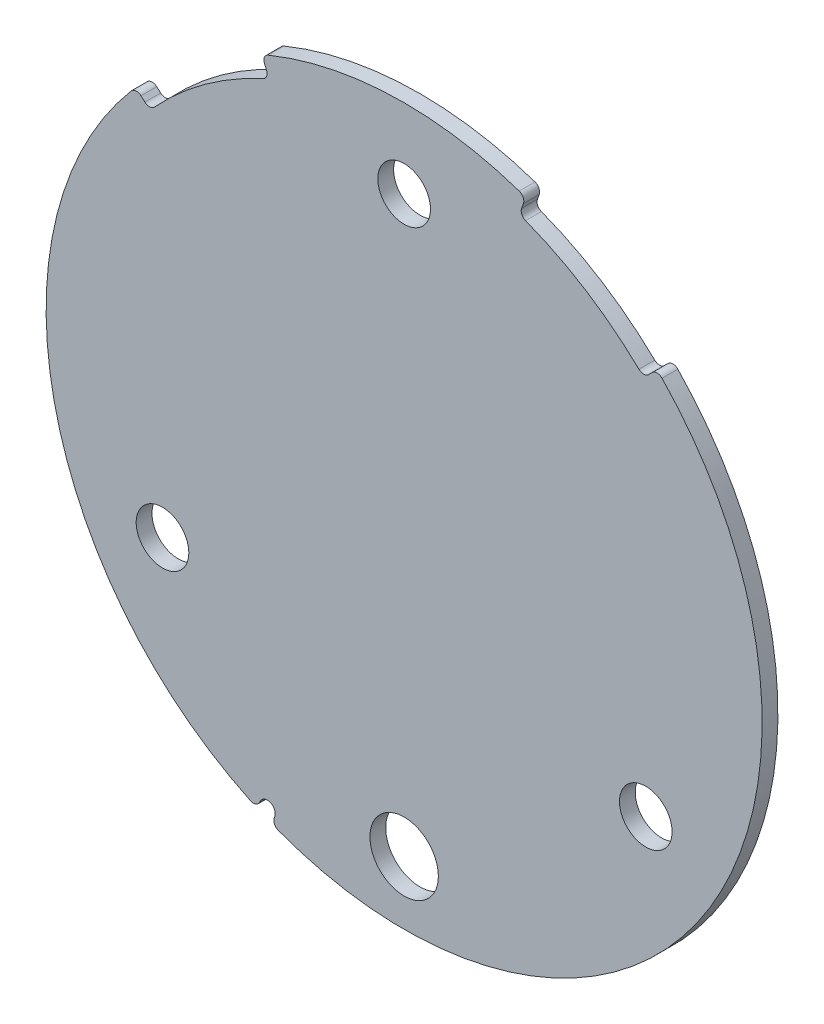
ISO-10303-21;
HEADER;
FILE_DESCRIPTION(('STEP AP214'),'2;1');
FILE_NAME('part.step','',(''),(''),'','','');
FILE_SCHEMA(('AUTOMOTIVE_DESIGN { 1 0 10303 214 1 1 1 1 }'));
ENDSEC;
DATA;
#1=APPLICATION_CONTEXT('core data for automotive mechanical design processes');
#2=APPLICATION_PROTOCOL_DEFINITION('international standard','automotive_design',2000,#1);
#3=PRODUCT_CONTEXT('',#1,'mechanical');
#4=PRODUCT('Part','Part','',(#3));
#5=PRODUCT_RELATED_PRODUCT_CATEGORY('part','',(#4));
#6=PRODUCT_DEFINITION_FORMATION('','',#4);
#7=PRODUCT_DEFINITION_CONTEXT('part definition',#1,'design');
#8=PRODUCT_DEFINITION('design','',#6,#7);
#9=PRODUCT_DEFINITION_SHAPE('','',#8);
#10=(LENGTH_UNIT() NAMED_UNIT(*) SI_UNIT(.MILLI.,.METRE.));
#11=(NAMED_UNIT(*) PLANE_ANGLE_UNIT() SI_UNIT($,.RADIAN.));
#12=(NAMED_UNIT(*) SI_UNIT($,.STERADIAN.) SOLID_ANGLE_UNIT());
#13=UNCERTAINTY_MEASURE_WITH_UNIT(LENGTH_MEASURE(1.E-05),#10,'distance_accuracy_value','');
#14=(GEOMETRIC_REPRESENTATION_CONTEXT(3) GLOBAL_UNCERTAINTY_ASSIGNED_CONTEXT((#13)) GLOBAL_UNIT_ASSIGNED_CONTEXT((#10,
#11,#12)) REPRESENTATION_CONTEXT('',''));
#15=CARTESIAN_POINT('',(0.,0.,0.));
#16=DIRECTION('',(0.,0.,1.));
#17=DIRECTION('',(1.,0.,0.));
#18=AXIS2_PLACEMENT_3D('',#15,#16,#17);
#19=CARTESIAN_POINT('',(0.,0.,1.5));
#20=DIRECTION('',(0.,0.,-1.));
#21=DIRECTION('',(-1.,0.,0.));
#22=AXIS2_PLACEMENT_3D('',#19,#20,#21);
#23=CYLINDRICAL_SURFACE('',#22,34.0030767667637);
#24=CARTESIAN_POINT('',(0.,0.,0.));
#25=DIRECTION('',(0.,0.,1.));
#26=DIRECTION('',(-1.,0.,0.));
#27=AXIS2_PLACEMENT_3D('',#24,#25,#26);
#28=CIRCLE('',#27,34.0030767667637);
#29=CARTESIAN_POINT('',(-25.9225243432384,22.0052712157937,0.));
#30=VERTEX_POINT('',#29);
#31=CARTESIAN_POINT('',(-14.58996740595,-30.7138744006636,0.));
#32=VERTEX_POINT('',#31);
#33=EDGE_CURVE('E323',#30,#32,#28,.T.);
#34=ORIENTED_EDGE('',*,*,#33,.T.);
#35=DIRECTION('',(0.,0.,-1.));
#36=VECTOR('',#35,1.);
#37=CARTESIAN_POINT('',(-14.58996740595,-30.7138744006636,1.5));
#38=LINE('',#37,#36);
#39=CARTESIAN_POINT('',(-14.58996740595,-30.7138744006636,1.5));
#40=VERTEX_POINT('',#39);
#41=EDGE_CURVE('E56',#32,#40,#38,.F.);
#42=ORIENTED_EDGE('',*,*,#41,.T.);
#43=CARTESIAN_POINT('',(0.,0.,1.5));
#44=DIRECTION('',(0.,0.,1.));
#45=DIRECTION('',(-1.,0.,0.));
#46=AXIS2_PLACEMENT_3D('',#43,#44,#45);
#47=CIRCLE('',#46,34.0030767667637);
#48=CARTESIAN_POINT('',(-25.9225243432384,22.0052712157937,1.5));
#49=VERTEX_POINT('',#48);
#50=EDGE_CURVE('E250',#49,#40,#47,.T.);
#51=ORIENTED_EDGE('',*,*,#50,.F.);
#52=DIRECTION('',(0.,0.,-1.));
#53=VECTOR('',#52,1.);
#54=CARTESIAN_POINT('',(-25.9225243432384,22.0052712157937,1.5));
#55=LINE('',#54,#53);
#56=EDGE_CURVE('E404',#49,#30,#55,.T.);
#57=ORIENTED_EDGE('',*,*,#56,.T.);
#58=EDGE_LOOP('',(#34,#42,#51,#57));
#59=FACE_BOUND('',#58,.T.);
#60=ADVANCED_FACE('F48',(#59),#23,.T.);
#61=CARTESIAN_POINT('',(-11.9586692957327,-31.8307941823908,1.5));
#62=VERTEX_POINT('',#61);
#63=CARTESIAN_POINT('',(24.4958433784449,23.5831059613682,1.5));
#64=VERTEX_POINT('',#63);
#65=EDGE_CURVE('E251',#62,#64,#47,.T.);
#66=ORIENTED_EDGE('',*,*,#65,.F.);
#67=DIRECTION('',(0.,0.,-1.));
#68=VECTOR('',#67,1.);
#69=CARTESIAN_POINT('',(-11.9586692957327,-31.8307941823908,1.5));
#70=LINE('',#69,#68);
#71=CARTESIAN_POINT('',(-11.9586692957327,-31.8307941823908,0.));
#72=VERTEX_POINT('',#71);
#73=EDGE_CURVE('E424',#62,#72,#70,.T.);
#74=ORIENTED_EDGE('',*,*,#73,.T.);
#75=CARTESIAN_POINT('',(24.4958433784449,23.5831059613682,0.));
#76=VERTEX_POINT('',#75);
#77=EDGE_CURVE('E319',#72,#76,#28,.T.);
#78=ORIENTED_EDGE('',*,*,#77,.T.);
#79=DIRECTION('',(0.,0.,-1.));
#80=VECTOR('',#79,1.);
#81=CARTESIAN_POINT('',(24.4958433784449,23.5831059613682,1.5));
#82=LINE('',#81,#80);
#83=EDGE_CURVE('E757',#76,#64,#82,.F.);
#84=ORIENTED_EDGE('',*,*,#83,.T.);
#85=EDGE_LOOP('',(#66,#74,#78,#84));
#86=FACE_BOUND('',#85,.T.);
#87=ADVANCED_FACE('F483',(#86),#23,.T.);
#88=CARTESIAN_POINT('',(0.,-28.0037090147275,1.5));
#89=DIRECTION('',(0.,0.,-1.));
#90=DIRECTION('',(-1.,0.,0.));
#91=AXIS2_PLACEMENT_3D('',#88,#89,#90);
#92=CYLINDRICAL_SURFACE('',#91,3.25);
#93=CARTESIAN_POINT('',(0.,-28.0037090147275,1.5));
#94=DIRECTION('',(0.,0.,1.));
#95=DIRECTION('',(1.,0.,0.));
#96=AXIS2_PLACEMENT_3D('',#93,#94,#95);
#97=CIRCLE('',#96,3.25);
#98=CARTESIAN_POINT('',(3.25,-28.0037090147275,1.5));
#99=VERTEX_POINT('',#98);
#100=EDGE_CURVE('E315',#99,#99,#97,.T.);
#101=ORIENTED_EDGE('',*,*,#100,.T.);
#102=EDGE_LOOP('',(#101));
#103=FACE_BOUND('',#102,.T.);
#104=CARTESIAN_POINT('',(0.,-28.0037090147275,0.));
#105=DIRECTION('',(0.,0.,1.));
#106=DIRECTION('',(1.,0.,0.));
#107=AXIS2_PLACEMENT_3D('',#104,#105,#106);
#108=CIRCLE('',#107,3.25);
#109=CARTESIAN_POINT('',(3.25,-28.0037090147275,0.));
#110=VERTEX_POINT('',#109);
#111=EDGE_CURVE('E252',#110,#110,#108,.T.);
#112=ORIENTED_EDGE('',*,*,#111,.F.);
#113=EDGE_LOOP('',(#112));
#114=FACE_BOUND('',#113,.T.);
#115=ADVANCED_FACE('F488',(#103,#114),#92,.F.);
#116=CARTESIAN_POINT('',(10.9270923149167,32.1995012872515,0.));
#117=VERTEX_POINT('',#116);
#118=CARTESIAN_POINT('',(-12.917756023464,31.4537884669667,0.));
#119=VERTEX_POINT('',#118);
#120=EDGE_CURVE('E253',#117,#119,#28,.T.);
#121=ORIENTED_EDGE('',*,*,#120,.T.);
#122=DIRECTION('',(0.,0.,-1.));
#123=VECTOR('',#122,1.);
#124=CARTESIAN_POINT('',(-12.917756023464,31.4537884669667,1.5));
#125=LINE('',#124,#123);
#126=CARTESIAN_POINT('',(-12.917756023464,31.4537884669667,1.5));
#127=VERTEX_POINT('',#126);
#128=EDGE_CURVE('E386',#119,#127,#125,.F.);
#129=ORIENTED_EDGE('',*,*,#128,.T.);
#130=CARTESIAN_POINT('',(10.9270923149167,32.1995012872515,1.5));
#131=VERTEX_POINT('',#130);
#132=EDGE_CURVE('E243',#131,#127,#47,.T.);
#133=ORIENTED_EDGE('',*,*,#132,.F.);
#134=DIRECTION('',(0.,0.,-1.));
#135=VECTOR('',#134,1.);
#136=CARTESIAN_POINT('',(10.9270923149167,32.1995012872515,1.5));
#137=LINE('',#136,#135);
#138=EDGE_CURVE('E360',#131,#117,#137,.T.);
#139=ORIENTED_EDGE('',*,*,#138,.T.);
#140=EDGE_LOOP('',(#121,#129,#133,#139));
#141=FACE_BOUND('',#140,.T.);
#142=ADVANCED_FACE('F443',(#141),#23,.T.);
#143=CARTESIAN_POINT('',(0.,-28.0037090147275,1.5));
#144=DIRECTION('',(0.,0.,-1.));
#145=DIRECTION('',(-1.,0.,0.));
#146=AXIS2_PLACEMENT_3D('',#143,#144,#145);
#147=PLANE('',#146);
#148=CARTESIAN_POINT('',(-22.9496732002842,-13.250000000002,1.5));
#149=DIRECTION('',(0.,0.,1.));
#150=DIRECTION('',(1.,0.,0.));
#151=AXIS2_PLACEMENT_3D('',#148,#149,#150);
#152=CIRCLE('',#151,2.50000000000405);
#153=CARTESIAN_POINT('',(-20.4496732002802,-13.250000000002,1.5));
#154=VERTEX_POINT('',#153);
#155=EDGE_CURVE('E232',#154,#154,#152,.T.);
#156=ORIENTED_EDGE('',*,*,#155,.F.);
#157=EDGE_LOOP('',(#156));
#158=FACE_BOUND('',#157,.T.);
#159=CARTESIAN_POINT('',(22.949673200291,-13.249999999998,1.5));
#160=DIRECTION('',(0.,0.,1.));
#161=DIRECTION('',(1.,0.,0.));
#162=AXIS2_PLACEMENT_3D('',#159,#160,#161);
#163=CIRCLE('',#162,2.50000000000279);
#164=CARTESIAN_POINT('',(25.4496732002938,-13.249999999998,1.5));
#165=VERTEX_POINT('',#164);
#166=EDGE_CURVE('E524',#165,#165,#163,.T.);
#167=ORIENTED_EDGE('',*,*,#166,.F.);
#168=EDGE_LOOP('',(#167));
#169=FACE_BOUND('',#168,.T.);
#170=CARTESIAN_POINT('',(0.,26.5,1.5));
#171=DIRECTION('',(0.,0.,1.));
#172=DIRECTION('',(1.,0.,0.));
#173=AXIS2_PLACEMENT_3D('',#170,#171,#172);
#174=CIRCLE('',#173,2.5);
#175=CARTESIAN_POINT('',(2.5,26.5,1.5));
#176=VERTEX_POINT('',#175);
#177=EDGE_CURVE('E525',#176,#176,#174,.T.);
#178=ORIENTED_EDGE('',*,*,#177,.F.);
#179=EDGE_LOOP('',(#178));
#180=FACE_BOUND('',#179,.T.);
#181=DIRECTION('',(0.369870387810276,0.92908336344005,0.));
#182=VECTOR('',#181,1.);
#183=CARTESIAN_POINT('',(0.,0.,1.5));
#184=LINE('',#183,#182);
#185=CARTESIAN_POINT('',(-12.3339725498959,-30.9819036043308,1.5));
#186=VERTEX_POINT('',#185);
#187=CARTESIAN_POINT('',(-12.296199688238,-30.8870213468903,1.5));
#188=VERTEX_POINT('',#187);
#189=EDGE_CURVE('E214',#186,#188,#184,.T.);
#190=ORIENTED_EDGE('',*,*,#189,.F.);
#191=CARTESIAN_POINT('',(-11.7300683636599,-31.2223193564075,1.5));
#192=DIRECTION('',(0.,0.,-1.));
#193=DIRECTION('',(-1.,0.,0.));
#194=AXIS2_PLACEMENT_3D('',#191,#192,#193);
#195=CIRCLE('',#194,0.65);
#196=EDGE_CURVE('E421',#186,#62,#195,.F.);
#197=ORIENTED_EDGE('',*,*,#196,.T.);
#198=ORIENTED_EDGE('',*,*,#65,.T.);
#199=CARTESIAN_POINT('',(24.0275828646919,23.1322932605048,1.5));
#200=DIRECTION('',(0.,0.,-1.));
#201=DIRECTION('',(-1.,0.,0.));
#202=AXIS2_PLACEMENT_3D('',#199,#200,#201);
#203=CIRCLE('',#202,0.65);
#204=CARTESIAN_POINT('',(23.5677301064265,23.5916791992488,1.5));
#205=VERTEX_POINT('',#204);
#206=EDGE_CURVE('E362',#64,#205,#203,.F.);
#207=ORIENTED_EDGE('',*,*,#206,.T.);
#208=DIRECTION('',(0.706747598067706,0.707465781946751,0.));
#209=VECTOR('',#208,1.);
#210=CARTESIAN_POINT('',(0.,0.,1.5));
#211=LINE('',#210,#209);
#212=CARTESIAN_POINT('',(23.2142881607075,23.237878092341,1.5));
#213=VERTEX_POINT('',#212);
#214=EDGE_CURVE('E311',#213,#205,#211,.T.);
#215=ORIENTED_EDGE('',*,*,#214,.F.);
#216=CARTESIAN_POINT('',(22.7544354024422,23.697264031085,1.5));
#217=DIRECTION('',(0.,0.,-1.));
#218=DIRECTION('',(-1.,0.,0.));
#219=AXIS2_PLACEMENT_3D('',#216,#217,#218);
#220=CIRCLE('',#219,0.65);
#221=CARTESIAN_POINT('',(22.3042375985473,23.2284123089294,1.5));
#222=VERTEX_POINT('',#221);
#223=EDGE_CURVE('E364',#213,#222,#220,.T.);
#224=ORIENTED_EDGE('',*,*,#223,.T.);
#225=CARTESIAN_POINT('',(0.,0.,1.5));
#226=DIRECTION('',(0.,0.,1.));
#227=DIRECTION('',(1.,0.,0.));
#228=AXIS2_PLACEMENT_3D('',#225,#226,#227);
#229=CIRCLE('',#228,32.2030767667637);
#230=CARTESIAN_POINT('',(11.538084564747,30.0651086447866,1.5));
#231=VERTEX_POINT('',#230);
#232=EDGE_CURVE('E328',#231,#222,#229,.F.);
#233=ORIENTED_EDGE('',*,*,#232,.F.);
#234=CARTESIAN_POINT('',(11.7709739566956,30.6719550265982,1.5));
#235=DIRECTION('',(0.,0.,-1.));
#236=DIRECTION('',(-1.,0.,0.));
#237=AXIS2_PLACEMENT_3D('',#234,#235,#236);
#238=CIRCLE('',#237,0.65);
#239=CARTESIAN_POINT('',(11.1596386311386,30.8927923416655,1.5));
#240=VERTEX_POINT('',#239);
#241=EDGE_CURVE('E353',#231,#240,#238,.T.);
#242=ORIENTED_EDGE('',*,*,#241,.T.);
#243=DIRECTION('',(0.339749715488171,0.94051588547228,0.));
#244=VECTOR('',#243,1.);
#245=CARTESIAN_POINT('',(0.,0.,1.5));
#246=LINE('',#245,#244);
#247=CARTESIAN_POINT('',(11.329546248551,31.3631409717135,1.5));
#248=VERTEX_POINT('',#247);
#249=EDGE_CURVE('E281',#240,#248,#246,.T.);
#250=ORIENTED_EDGE('',*,*,#249,.T.);
#251=CARTESIAN_POINT('',(10.718210922994,31.5839782867808,1.5));
#252=DIRECTION('',(0.,0.,-1.));
#253=DIRECTION('',(-1.,0.,0.));
#254=AXIS2_PLACEMENT_3D('',#251,#252,#253);
#255=CIRCLE('',#254,0.65);
#256=EDGE_CURVE('E350',#248,#131,#255,.F.);
#257=ORIENTED_EDGE('',*,*,#256,.T.);
#258=ORIENTED_EDGE('',*,*,#132,.T.);
#259=CARTESIAN_POINT('',(-12.6708212689167,30.8525204510231,1.5));
#260=DIRECTION('',(0.,0.,-1.));
#261=DIRECTION('',(-1.,0.,0.));
#262=AXIS2_PLACEMENT_3D('',#259,#260,#261);
#263=CIRCLE('',#262,0.65);
#264=CARTESIAN_POINT('',(-13.2671627159064,30.5939148080022,1.5));
#265=VERTEX_POINT('',#264);
#266=EDGE_CURVE('E392',#127,#265,#263,.F.);
#267=ORIENTED_EDGE('',*,*,#266,.T.);
#268=DIRECTION('',(-0.397854835416819,0.917448379984104,0.));
#269=VECTOR('',#268,1.);
#270=CARTESIAN_POINT('',(-12.8109257004215,29.5418378354882,1.5));
#271=LINE('',#270,#269);
#272=CARTESIAN_POINT('',(-13.0669725896484,30.1322788275527,1.5));
#273=VERTEX_POINT('',#272);
#274=EDGE_CURVE('E267',#273,#265,#271,.T.);
#275=ORIENTED_EDGE('',*,*,#274,.F.);
#276=CARTESIAN_POINT('',(-13.6633140366381,29.8736731845317,1.5));
#277=DIRECTION('',(0.,0.,-1.));
#278=DIRECTION('',(-1.,0.,0.));
#279=AXIS2_PLACEMENT_3D('',#276,#277,#278);
#280=CIRCLE('',#279,0.65);
#281=CARTESIAN_POINT('',(-13.3929592687898,29.2825654959489,1.5));
#282=VERTEX_POINT('',#281);
#283=EDGE_CURVE('E410',#273,#282,#280,.T.);
#284=ORIENTED_EDGE('',*,*,#283,.T.);
#285=CARTESIAN_POINT('',(0.,0.,1.5));
#286=DIRECTION('',(0.,0.,-1.));
#287=DIRECTION('',(-1.,0.,0.));
#288=AXIS2_PLACEMENT_3D('',#285,#286,#287);
#289=CIRCLE('',#288,32.2);
#290=CARTESIAN_POINT('',(-23.7107227097344,21.7862715622037,1.5));
#291=VERTEX_POINT('',#290);
#292=EDGE_CURVE('E274',#291,#282,#289,.T.);
#293=ORIENTED_EDGE('',*,*,#292,.F.);
#294=CARTESIAN_POINT('',(-24.1893553110178,22.226056547155,1.5));
#295=DIRECTION('',(0.,0.,-1.));
#296=DIRECTION('',(-1.,0.,0.));
#297=AXIS2_PLACEMENT_3D('',#294,#295,#296);
#298=CIRCLE('',#297,0.65);
#299=CARTESIAN_POINT('',(-24.6195835345336,21.7388156665934,1.5));
#300=VERTEX_POINT('',#299);
#301=EDGE_CURVE('E405',#291,#300,#298,.T.);
#302=ORIENTED_EDGE('',*,*,#301,.T.);
#303=DIRECTION('',(0.749601354710271,-0.661889574639551,0.));
#304=VECTOR('',#303,1.);
#305=CARTESIAN_POINT('',(-24.1371636216708,21.3128443033935,1.5));
#306=LINE('',#305,#304);
#307=CARTESIAN_POINT('',(-24.9967632907766,22.0718611538428,1.5));
#308=VERTEX_POINT('',#307);
#309=EDGE_CURVE('E273',#308,#300,#306,.T.);
#310=ORIENTED_EDGE('',*,*,#309,.F.);
#311=CARTESIAN_POINT('',(-25.4269915142923,21.5846202732812,1.5));
#312=DIRECTION('',(0.,0.,-1.));
#313=DIRECTION('',(-1.,0.,0.));
#314=AXIS2_PLACEMENT_3D('',#311,#312,#313);
#315=CIRCLE('',#314,0.65);
#316=EDGE_CURVE('E389',#308,#49,#315,.F.);
#317=ORIENTED_EDGE('',*,*,#316,.T.);
#318=ORIENTED_EDGE('',*,*,#50,.T.);
#319=CARTESIAN_POINT('',(-14.3110667970752,-30.1267505207462,1.5));
#320=DIRECTION('',(0.,0.,-1.));
#321=DIRECTION('',(-1.,0.,0.));
#322=AXIS2_PLACEMENT_3D('',#319,#320,#321);
#323=CIRCLE('',#322,0.65);
#324=CARTESIAN_POINT('',(-13.718619080054,-30.3941560229267,1.5));
#325=VERTEX_POINT('',#324);
#326=EDGE_CURVE('E418',#40,#325,#323,.F.);
#327=ORIENTED_EDGE('',*,*,#326,.T.);
#328=DIRECTION('',(0.411393080277604,0.911458026186453,0.));
#329=VECTOR('',#328,1.);
#330=CARTESIAN_POINT('',(0.,0.,1.5));
#331=LINE('',#330,#329);
#332=CARTESIAN_POINT('',(-13.6766057304579,-30.3010737458243,1.5));
#333=VERTEX_POINT('',#332);
#334=EDGE_CURVE('E208',#325,#333,#331,.T.);
#335=ORIENTED_EDGE('',*,*,#334,.T.);
#336=CARTESIAN_POINT('',(-12.9930122108181,-30.6096185560325,1.5));
#337=DIRECTION('',(0.,0.,1.));
#338=DIRECTION('',(1.,0.,0.));
#339=AXIS2_PLACEMENT_3D('',#336,#337,#338);
#340=CIRCLE('',#339,0.750000000000003);
#341=EDGE_CURVE('E231',#188,#333,#340,.T.);
#342=ORIENTED_EDGE('',*,*,#341,.F.);
#343=EDGE_LOOP('',(#190,#197,#198,#207,#215,#224,#233,#242,#250,#257,#258,#267,#275,#284,#293,
#302,#310,#317,#318,#327,#335,#342));
#344=FACE_BOUND('',#343,.T.);
#345=ORIENTED_EDGE('',*,*,#100,.F.);
#346=EDGE_LOOP('',(#345));
#347=FACE_BOUND('',#346,.T.);
#348=ADVANCED_FACE('F348',(#158,#169,#180,#344,#347),#147,.F.);
#349=CARTESIAN_POINT('',(0.,-28.0037090147275,0.));
#350=DIRECTION('',(0.,0.,-1.));
#351=DIRECTION('',(-1.,0.,0.));
#352=AXIS2_PLACEMENT_3D('',#349,#350,#351);
#353=PLANE('',#352);
#354=CARTESIAN_POINT('',(-22.9496732002842,-13.250000000002,0.));
#355=DIRECTION('',(0.,0.,1.));
#356=DIRECTION('',(1.,0.,0.));
#357=AXIS2_PLACEMENT_3D('',#354,#355,#356);
#358=CIRCLE('',#357,2.50000000000405);
#359=CARTESIAN_POINT('',(-20.4496732002802,-13.250000000002,0.));
#360=VERTEX_POINT('',#359);
#361=EDGE_CURVE('E515',#360,#360,#358,.T.);
#362=ORIENTED_EDGE('',*,*,#361,.T.);
#363=EDGE_LOOP('',(#362));
#364=FACE_BOUND('',#363,.T.);
#365=CARTESIAN_POINT('',(22.949673200291,-13.249999999998,0.));
#366=DIRECTION('',(0.,0.,1.));
#367=DIRECTION('',(1.,0.,0.));
#368=AXIS2_PLACEMENT_3D('',#365,#366,#367);
#369=CIRCLE('',#368,2.50000000000279);
#370=CARTESIAN_POINT('',(25.4496732002938,-13.249999999998,0.));
#371=VERTEX_POINT('',#370);
#372=EDGE_CURVE('E519',#371,#371,#369,.T.);
#373=ORIENTED_EDGE('',*,*,#372,.T.);
#374=EDGE_LOOP('',(#373));
#375=FACE_BOUND('',#374,.T.);
#376=CARTESIAN_POINT('',(0.,26.5,0.));
#377=DIRECTION('',(0.,0.,1.));
#378=DIRECTION('',(1.,0.,0.));
#379=AXIS2_PLACEMENT_3D('',#376,#377,#378);
#380=CIRCLE('',#379,2.5);
#381=CARTESIAN_POINT('',(2.5,26.5,0.));
#382=VERTEX_POINT('',#381);
#383=EDGE_CURVE('E522',#382,#382,#380,.T.);
#384=ORIENTED_EDGE('',*,*,#383,.T.);
#385=EDGE_LOOP('',(#384));
#386=FACE_BOUND('',#385,.T.);
#387=ORIENTED_EDGE('',*,*,#77,.F.);
#388=CARTESIAN_POINT('',(-11.7300683636599,-31.2223193564075,0.));
#389=DIRECTION('',(0.,0.,-1.));
#390=DIRECTION('',(-1.,0.,0.));
#391=AXIS2_PLACEMENT_3D('',#388,#389,#390);
#392=CIRCLE('',#391,0.65);
#393=CARTESIAN_POINT('',(-12.3339725498959,-30.9819036043308,0.));
#394=VERTEX_POINT('',#393);
#395=EDGE_CURVE('E204',#72,#394,#392,.T.);
#396=ORIENTED_EDGE('',*,*,#395,.T.);
#397=DIRECTION('',(0.369870387810276,0.92908336344005,0.));
#398=VECTOR('',#397,1.);
#399=CARTESIAN_POINT('',(0.,0.,0.));
#400=LINE('',#399,#398);
#401=CARTESIAN_POINT('',(-12.296199688238,-30.8870213468903,0.));
#402=VERTEX_POINT('',#401);
#403=EDGE_CURVE('E196',#394,#402,#400,.T.);
#404=ORIENTED_EDGE('',*,*,#403,.T.);
#405=CARTESIAN_POINT('',(-12.9930122108181,-30.6096185560325,0.));
#406=DIRECTION('',(0.,0.,1.));
#407=DIRECTION('',(1.,0.,0.));
#408=AXIS2_PLACEMENT_3D('',#405,#406,#407);
#409=CIRCLE('',#408,0.750000000000003);
#410=CARTESIAN_POINT('',(-13.6766057304579,-30.3010737458243,0.));
#411=VERTEX_POINT('',#410);
#412=EDGE_CURVE('E202',#402,#411,#409,.T.);
#413=ORIENTED_EDGE('',*,*,#412,.T.);
#414=DIRECTION('',(0.411393080277604,0.911458026186453,0.));
#415=VECTOR('',#414,1.);
#416=CARTESIAN_POINT('',(0.,0.,0.));
#417=LINE('',#416,#415);
#418=CARTESIAN_POINT('',(-13.718619080054,-30.3941560229267,0.));
#419=VERTEX_POINT('',#418);
#420=EDGE_CURVE('E219',#419,#411,#417,.T.);
#421=ORIENTED_EDGE('',*,*,#420,.F.);
#422=CARTESIAN_POINT('',(-14.3110667970752,-30.1267505207462,0.));
#423=DIRECTION('',(0.,0.,-1.));
#424=DIRECTION('',(-1.,0.,0.));
#425=AXIS2_PLACEMENT_3D('',#422,#423,#424);
#426=CIRCLE('',#425,0.65);
#427=EDGE_CURVE('E63',#419,#32,#426,.T.);
#428=ORIENTED_EDGE('',*,*,#427,.T.);
#429=ORIENTED_EDGE('',*,*,#33,.F.);
#430=CARTESIAN_POINT('',(-25.4269915142923,21.5846202732812,0.));
#431=DIRECTION('',(0.,0.,-1.));
#432=DIRECTION('',(-1.,0.,0.));
#433=AXIS2_PLACEMENT_3D('',#430,#431,#432);
#434=CIRCLE('',#433,0.65);
#435=CARTESIAN_POINT('',(-24.9967632907766,22.0718611538428,0.));
#436=VERTEX_POINT('',#435);
#437=EDGE_CURVE('E400',#30,#436,#434,.T.);
#438=ORIENTED_EDGE('',*,*,#437,.T.);
#439=DIRECTION('',(0.749601354710271,-0.661889574639551,0.));
#440=VECTOR('',#439,1.);
#441=CARTESIAN_POINT('',(-24.1371636216708,21.3128443033935,0.));
#442=LINE('',#441,#440);
#443=CARTESIAN_POINT('',(-24.6195835345336,21.7388156665934,0.));
#444=VERTEX_POINT('',#443);
#445=EDGE_CURVE('E296',#436,#444,#442,.T.);
#446=ORIENTED_EDGE('',*,*,#445,.T.);
#447=CARTESIAN_POINT('',(-24.1893553110178,22.226056547155,0.));
#448=DIRECTION('',(0.,0.,-1.));
#449=DIRECTION('',(-1.,0.,0.));
#450=AXIS2_PLACEMENT_3D('',#447,#448,#449);
#451=CIRCLE('',#450,0.65);
#452=CARTESIAN_POINT('',(-23.7107227097344,21.7862715622037,0.));
#453=VERTEX_POINT('',#452);
#454=EDGE_CURVE('E409',#444,#453,#451,.F.);
#455=ORIENTED_EDGE('',*,*,#454,.T.);
#456=CARTESIAN_POINT('',(0.,0.,0.));
#457=DIRECTION('',(0.,0.,-1.));
#458=DIRECTION('',(-1.,0.,0.));
#459=AXIS2_PLACEMENT_3D('',#456,#457,#458);
#460=CIRCLE('',#459,32.2);
#461=CARTESIAN_POINT('',(-13.3929592687898,29.2825654959489,0.));
#462=VERTEX_POINT('',#461);
#463=EDGE_CURVE('E280',#453,#462,#460,.T.);
#464=ORIENTED_EDGE('',*,*,#463,.T.);
#465=CARTESIAN_POINT('',(-13.6633140366381,29.8736731845317,0.));
#466=DIRECTION('',(0.,0.,-1.));
#467=DIRECTION('',(-1.,0.,0.));
#468=AXIS2_PLACEMENT_3D('',#465,#466,#467);
#469=CIRCLE('',#468,0.65);
#470=CARTESIAN_POINT('',(-13.0669725896484,30.1322788275527,0.));
#471=VERTEX_POINT('',#470);
#472=EDGE_CURVE('E414',#462,#471,#469,.F.);
#473=ORIENTED_EDGE('',*,*,#472,.T.);
#474=DIRECTION('',(-0.397854835416819,0.917448379984104,0.));
#475=VECTOR('',#474,1.);
#476=CARTESIAN_POINT('',(-12.8109257004215,29.5418378354882,0.));
#477=LINE('',#476,#475);
#478=CARTESIAN_POINT('',(-13.2671627159064,30.5939148080022,0.));
#479=VERTEX_POINT('',#478);
#480=EDGE_CURVE('E294',#471,#479,#477,.T.);
#481=ORIENTED_EDGE('',*,*,#480,.T.);
#482=CARTESIAN_POINT('',(-12.6708212689167,30.8525204510231,0.));
#483=DIRECTION('',(0.,0.,-1.));
#484=DIRECTION('',(-1.,0.,0.));
#485=AXIS2_PLACEMENT_3D('',#482,#483,#484);
#486=CIRCLE('',#485,0.65);
#487=EDGE_CURVE('E402',#479,#119,#486,.T.);
#488=ORIENTED_EDGE('',*,*,#487,.T.);
#489=ORIENTED_EDGE('',*,*,#120,.F.);
#490=CARTESIAN_POINT('',(10.718210922994,31.5839782867808,0.));
#491=DIRECTION('',(0.,0.,-1.));
#492=DIRECTION('',(-1.,0.,0.));
#493=AXIS2_PLACEMENT_3D('',#490,#491,#492);
#494=CIRCLE('',#493,0.65);
#495=CARTESIAN_POINT('',(11.329546248551,31.3631409717135,0.));
#496=VERTEX_POINT('',#495);
#497=EDGE_CURVE('E366',#117,#496,#494,.T.);
#498=ORIENTED_EDGE('',*,*,#497,.T.);
#499=DIRECTION('',(0.339749715488171,0.94051588547228,0.));
#500=VECTOR('',#499,1.);
#501=CARTESIAN_POINT('',(0.,0.,0.));
#502=LINE('',#501,#500);
#503=CARTESIAN_POINT('',(11.1596386311386,30.8927923416655,0.));
#504=VERTEX_POINT('',#503);
#505=EDGE_CURVE('E298',#504,#496,#502,.T.);
#506=ORIENTED_EDGE('',*,*,#505,.F.);
#507=CARTESIAN_POINT('',(11.7709739566956,30.6719550265982,0.));
#508=DIRECTION('',(0.,0.,-1.));
#509=DIRECTION('',(-1.,0.,0.));
#510=AXIS2_PLACEMENT_3D('',#507,#508,#509);
#511=CIRCLE('',#510,0.65);
#512=CARTESIAN_POINT('',(11.538084564747,30.0651086447866,0.));
#513=VERTEX_POINT('',#512);
#514=EDGE_CURVE('E372',#504,#513,#511,.F.);
#515=ORIENTED_EDGE('',*,*,#514,.T.);
#516=CARTESIAN_POINT('',(0.,0.,0.));
#517=DIRECTION('',(0.,0.,1.));
#518=DIRECTION('',(1.,0.,0.));
#519=AXIS2_PLACEMENT_3D('',#516,#517,#518);
#520=CIRCLE('',#519,32.2030767667637);
#521=CARTESIAN_POINT('',(22.3042375985473,23.2284123089294,0.));
#522=VERTEX_POINT('',#521);
#523=EDGE_CURVE('E302',#513,#522,#520,.F.);
#524=ORIENTED_EDGE('',*,*,#523,.T.);
#525=CARTESIAN_POINT('',(22.7544354024422,23.697264031085,0.));
#526=DIRECTION('',(0.,0.,-1.));
#527=DIRECTION('',(-1.,0.,0.));
#528=AXIS2_PLACEMENT_3D('',#525,#526,#527);
#529=CIRCLE('',#528,0.65);
#530=CARTESIAN_POINT('',(23.2142881607075,23.237878092341,0.));
#531=VERTEX_POINT('',#530);
#532=EDGE_CURVE('E361',#522,#531,#529,.F.);
#533=ORIENTED_EDGE('',*,*,#532,.T.);
#534=DIRECTION('',(0.706747598067706,0.707465781946751,0.));
#535=VECTOR('',#534,1.);
#536=CARTESIAN_POINT('',(0.,0.,0.));
#537=LINE('',#536,#535);
#538=CARTESIAN_POINT('',(23.5677301064265,23.5916791992488,0.));
#539=VERTEX_POINT('',#538);
#540=EDGE_CURVE('E309',#531,#539,#537,.T.);
#541=ORIENTED_EDGE('',*,*,#540,.T.);
#542=CARTESIAN_POINT('',(24.0275828646919,23.1322932605048,0.));
#543=DIRECTION('',(0.,0.,-1.));
#544=DIRECTION('',(-1.,0.,0.));
#545=AXIS2_PLACEMENT_3D('',#542,#543,#544);
#546=CIRCLE('',#545,0.65);
#547=EDGE_CURVE('E775',#539,#76,#546,.T.);
#548=ORIENTED_EDGE('',*,*,#547,.T.);
#549=EDGE_LOOP('',(#387,#396,#404,#413,#421,#428,#429,#438,#446,#455,#464,#473,#481,#488,#489,
#498,#506,#515,#524,#533,#541,#548));
#550=FACE_BOUND('',#549,.T.);
#551=ORIENTED_EDGE('',*,*,#111,.T.);
#552=EDGE_LOOP('',(#551));
#553=FACE_BOUND('',#552,.T.);
#554=ADVANCED_FACE('F199',(#364,#375,#386,#550,#553),#353,.T.);
#555=CARTESIAN_POINT('',(0.,0.,1.5));
#556=DIRECTION('',(-0.94051588547228,0.339749715488171,0.));
#557=DIRECTION('',(-0.339749715488171,-0.94051588547228,0.));
#558=AXIS2_PLACEMENT_3D('',#555,#556,#557);
#559=PLANE('',#558);
#560=ORIENTED_EDGE('',*,*,#249,.F.);
#561=DIRECTION('',(0.,0.,-1.));
#562=VECTOR('',#561,1.);
#563=CARTESIAN_POINT('',(11.1596386311386,30.8927923416655,1.5));
#564=LINE('',#563,#562);
#565=EDGE_CURVE('E760',#240,#504,#564,.T.);
#566=ORIENTED_EDGE('',*,*,#565,.T.);
#567=ORIENTED_EDGE('',*,*,#505,.T.);
#568=DIRECTION('',(0.,0.,-1.));
#569=VECTOR('',#568,1.);
#570=CARTESIAN_POINT('',(11.329546248551,31.3631409717135,1.5));
#571=LINE('',#570,#569);
#572=EDGE_CURVE('E358',#496,#248,#571,.F.);
#573=ORIENTED_EDGE('',*,*,#572,.T.);
#574=EDGE_LOOP('',(#560,#566,#567,#573));
#575=FACE_BOUND('',#574,.T.);
#576=ADVANCED_FACE('F504',(#575),#559,.F.);
#577=CARTESIAN_POINT('',(0.,0.,1.5));
#578=DIRECTION('',(0.,0.,-1.));
#579=DIRECTION('',(-1.,0.,0.));
#580=AXIS2_PLACEMENT_3D('',#577,#578,#579);
#581=CYLINDRICAL_SURFACE('',#580,32.2030767667637);
#582=ORIENTED_EDGE('',*,*,#232,.T.);
#583=DIRECTION('',(0.,0.,-1.));
#584=VECTOR('',#583,1.);
#585=CARTESIAN_POINT('',(22.3042375985473,23.2284123089294,1.5));
#586=LINE('',#585,#584);
#587=EDGE_CURVE('E766',#222,#522,#586,.T.);
#588=ORIENTED_EDGE('',*,*,#587,.T.);
#589=ORIENTED_EDGE('',*,*,#523,.F.);
#590=DIRECTION('',(0.,0.,-1.));
#591=VECTOR('',#590,1.);
#592=CARTESIAN_POINT('',(11.538084564747,30.0651086447866,1.5));
#593=LINE('',#592,#591);
#594=EDGE_CURVE('E249',#513,#231,#593,.F.);
#595=ORIENTED_EDGE('',*,*,#594,.T.);
#596=EDGE_LOOP('',(#582,#588,#589,#595));
#597=FACE_BOUND('',#596,.T.);
#598=ADVANCED_FACE('F511',(#597),#581,.T.);
#599=CARTESIAN_POINT('',(0.,0.,1.5));
#600=DIRECTION('',(-0.707465781946751,0.706747598067706,0.));
#601=DIRECTION('',(-0.706747598067706,-0.707465781946751,0.));
#602=AXIS2_PLACEMENT_3D('',#599,#600,#601);
#603=PLANE('',#602);
#604=ORIENTED_EDGE('',*,*,#540,.F.);
#605=DIRECTION('',(0.,0.,1.));
#606=VECTOR('',#605,1.);
#607=CARTESIAN_POINT('',(23.2142881607075,23.237878092341,1.5));
#608=LINE('',#607,#606);
#609=EDGE_CURVE('E765',#531,#213,#608,.T.);
#610=ORIENTED_EDGE('',*,*,#609,.T.);
#611=ORIENTED_EDGE('',*,*,#214,.T.);
#612=DIRECTION('',(0.,0.,1.));
#613=VECTOR('',#612,1.);
#614=CARTESIAN_POINT('',(23.5677301064265,23.5916791992488,0.));
#615=LINE('',#614,#613);
#616=EDGE_CURVE('E762',#205,#539,#615,.F.);
#617=ORIENTED_EDGE('',*,*,#616,.T.);
#618=EDGE_LOOP('',(#604,#610,#611,#617));
#619=FACE_BOUND('',#618,.T.);
#620=ADVANCED_FACE('F574',(#619),#603,.T.);
#621=CARTESIAN_POINT('',(22.7544354024422,23.697264031085,1.5));
#622=DIRECTION('',(0.,0.,-1.));
#623=DIRECTION('',(-1.,0.,0.));
#624=AXIS2_PLACEMENT_3D('',#621,#622,#623);
#625=CYLINDRICAL_SURFACE('',#624,0.65);
#626=ORIENTED_EDGE('',*,*,#223,.F.);
#627=ORIENTED_EDGE('',*,*,#609,.F.);
#628=ORIENTED_EDGE('',*,*,#532,.F.);
#629=ORIENTED_EDGE('',*,*,#587,.F.);
#630=EDGE_LOOP('',(#626,#627,#628,#629));
#631=FACE_BOUND('',#630,.T.);
#632=ADVANCED_FACE('F576',(#631),#625,.F.);
#633=CARTESIAN_POINT('',(11.7709739566956,30.6719550265982,1.5));
#634=DIRECTION('',(0.,0.,-1.));
#635=DIRECTION('',(-1.,0.,0.));
#636=AXIS2_PLACEMENT_3D('',#633,#634,#635);
#637=CYLINDRICAL_SURFACE('',#636,0.65);
#638=ORIENTED_EDGE('',*,*,#241,.F.);
#639=ORIENTED_EDGE('',*,*,#594,.F.);
#640=ORIENTED_EDGE('',*,*,#514,.F.);
#641=ORIENTED_EDGE('',*,*,#565,.F.);
#642=EDGE_LOOP('',(#638,#639,#640,#641));
#643=FACE_BOUND('',#642,.T.);
#644=ADVANCED_FACE('F592',(#643),#637,.F.);
#645=CARTESIAN_POINT('',(10.718210922994,31.5839782867808,1.5));
#646=DIRECTION('',(0.,0.,-1.));
#647=DIRECTION('',(-1.,0.,0.));
#648=AXIS2_PLACEMENT_3D('',#645,#646,#647);
#649=CYLINDRICAL_SURFACE('',#648,0.65);
#650=ORIENTED_EDGE('',*,*,#256,.F.);
#651=ORIENTED_EDGE('',*,*,#572,.F.);
#652=ORIENTED_EDGE('',*,*,#497,.F.);
#653=ORIENTED_EDGE('',*,*,#138,.F.);
#654=EDGE_LOOP('',(#650,#651,#652,#653));
#655=FACE_BOUND('',#654,.T.);
#656=ADVANCED_FACE('F357',(#655),#649,.T.);
#657=CARTESIAN_POINT('',(24.0275828646919,23.1322932605048,1.5));
#658=DIRECTION('',(0.,0.,-1.));
#659=DIRECTION('',(-1.,0.,0.));
#660=AXIS2_PLACEMENT_3D('',#657,#658,#659);
#661=CYLINDRICAL_SURFACE('',#660,0.65);
#662=ORIENTED_EDGE('',*,*,#206,.F.);
#663=ORIENTED_EDGE('',*,*,#83,.F.);
#664=ORIENTED_EDGE('',*,*,#547,.F.);
#665=ORIENTED_EDGE('',*,*,#616,.F.);
#666=EDGE_LOOP('',(#662,#663,#664,#665));
#667=FACE_BOUND('',#666,.T.);
#668=ADVANCED_FACE('F573',(#667),#661,.T.);
#669=CARTESIAN_POINT('',(0.,0.,0.));
#670=DIRECTION('',(0.,0.,1.));
#671=DIRECTION('',(1.,0.,0.));
#672=AXIS2_PLACEMENT_3D('',#669,#670,#671);
#673=CYLINDRICAL_SURFACE('',#672,32.2);
#674=ORIENTED_EDGE('',*,*,#463,.F.);
#675=DIRECTION('',(0.,0.,1.));
#676=VECTOR('',#675,1.);
#677=CARTESIAN_POINT('',(-23.7107227097344,21.7862715622037,0.));
#678=LINE('',#677,#676);
#679=EDGE_CURVE('E378',#453,#291,#678,.T.);
#680=ORIENTED_EDGE('',*,*,#679,.T.);
#681=ORIENTED_EDGE('',*,*,#292,.T.);
#682=DIRECTION('',(0.,0.,1.));
#683=VECTOR('',#682,1.);
#684=CARTESIAN_POINT('',(-13.3929592687898,29.2825654959489,0.));
#685=LINE('',#684,#683);
#686=EDGE_CURVE('E376',#282,#462,#685,.F.);
#687=ORIENTED_EDGE('',*,*,#686,.T.);
#688=EDGE_LOOP('',(#674,#680,#681,#687));
#689=FACE_BOUND('',#688,.T.);
#690=ADVANCED_FACE('F461',(#689),#673,.T.);
#691=CARTESIAN_POINT('',(-24.1371636216708,21.3128443033935,0.));
#692=DIRECTION('',(-0.661889574639551,-0.749601354710271,0.));
#693=DIRECTION('',(0.749601354710271,-0.661889574639551,0.));
#694=AXIS2_PLACEMENT_3D('',#691,#692,#693);
#695=PLANE('',#694);
#696=ORIENTED_EDGE('',*,*,#309,.T.);
#697=DIRECTION('',(0.,0.,-1.));
#698=VECTOR('',#697,1.);
#699=CARTESIAN_POINT('',(-24.6195835345336,21.7388156665934,0.));
#700=LINE('',#699,#698);
#701=EDGE_CURVE('E384',#300,#444,#700,.T.);
#702=ORIENTED_EDGE('',*,*,#701,.T.);
#703=ORIENTED_EDGE('',*,*,#445,.F.);
#704=DIRECTION('',(0.,0.,-1.));
#705=VECTOR('',#704,1.);
#706=CARTESIAN_POINT('',(-24.9967632907766,22.0718611538428,0.));
#707=LINE('',#706,#705);
#708=EDGE_CURVE('E381',#436,#308,#707,.F.);
#709=ORIENTED_EDGE('',*,*,#708,.T.);
#710=EDGE_LOOP('',(#696,#702,#703,#709));
#711=FACE_BOUND('',#710,.T.);
#712=ADVANCED_FACE('F468',(#711),#695,.F.);
#713=CARTESIAN_POINT('',(-12.8109257004215,29.5418378354882,0.));
#714=DIRECTION('',(0.917448379984103,0.397854835416819,0.));
#715=DIRECTION('',(-0.397854835416819,0.917448379984104,0.));
#716=AXIS2_PLACEMENT_3D('',#713,#714,#715);
#717=PLANE('',#716);
#718=ORIENTED_EDGE('',*,*,#274,.T.);
#719=DIRECTION('',(0.,0.,-1.));
#720=VECTOR('',#719,1.);
#721=CARTESIAN_POINT('',(-13.2671627159064,30.5939148080022,0.));
#722=LINE('',#721,#720);
#723=EDGE_CURVE('E398',#265,#479,#722,.T.);
#724=ORIENTED_EDGE('',*,*,#723,.T.);
#725=ORIENTED_EDGE('',*,*,#480,.F.);
#726=DIRECTION('',(0.,0.,-1.));
#727=VECTOR('',#726,1.);
#728=CARTESIAN_POINT('',(-13.0669725896484,30.1322788275527,1.5));
#729=LINE('',#728,#727);
#730=EDGE_CURVE('E395',#471,#273,#729,.F.);
#731=ORIENTED_EDGE('',*,*,#730,.T.);
#732=EDGE_LOOP('',(#718,#724,#725,#731));
#733=FACE_BOUND('',#732,.T.);
#734=ADVANCED_FACE('F450',(#733),#717,.F.);
#735=CARTESIAN_POINT('',(-24.1893553110178,22.226056547155,0.));
#736=DIRECTION('',(0.,0.,1.));
#737=DIRECTION('',(1.,0.,0.));
#738=AXIS2_PLACEMENT_3D('',#735,#736,#737);
#739=CYLINDRICAL_SURFACE('',#738,0.65);
#740=ORIENTED_EDGE('',*,*,#454,.F.);
#741=ORIENTED_EDGE('',*,*,#701,.F.);
#742=ORIENTED_EDGE('',*,*,#301,.F.);
#743=ORIENTED_EDGE('',*,*,#679,.F.);
#744=EDGE_LOOP('',(#740,#741,#742,#743));
#745=FACE_BOUND('',#744,.T.);
#746=ADVANCED_FACE('F465',(#745),#739,.F.);
#747=CARTESIAN_POINT('',(-12.6708212689167,30.8525204510231,1.5));
#748=DIRECTION('',(0.,0.,-1.));
#749=DIRECTION('',(-1.,0.,0.));
#750=AXIS2_PLACEMENT_3D('',#747,#748,#749);
#751=CYLINDRICAL_SURFACE('',#750,0.65);
#752=ORIENTED_EDGE('',*,*,#487,.F.);
#753=ORIENTED_EDGE('',*,*,#723,.F.);
#754=ORIENTED_EDGE('',*,*,#266,.F.);
#755=ORIENTED_EDGE('',*,*,#128,.F.);
#756=EDGE_LOOP('',(#752,#753,#754,#755));
#757=FACE_BOUND('',#756,.T.);
#758=ADVANCED_FACE('F446',(#757),#751,.T.);
#759=CARTESIAN_POINT('',(-13.6633140366381,29.8736731845317,0.));
#760=DIRECTION('',(0.,0.,1.));
#761=DIRECTION('',(1.,0.,0.));
#762=AXIS2_PLACEMENT_3D('',#759,#760,#761);
#763=CYLINDRICAL_SURFACE('',#762,0.65);
#764=ORIENTED_EDGE('',*,*,#472,.F.);
#765=ORIENTED_EDGE('',*,*,#686,.F.);
#766=ORIENTED_EDGE('',*,*,#283,.F.);
#767=ORIENTED_EDGE('',*,*,#730,.F.);
#768=EDGE_LOOP('',(#764,#765,#766,#767));
#769=FACE_BOUND('',#768,.T.);
#770=ADVANCED_FACE('F455',(#769),#763,.F.);
#771=CARTESIAN_POINT('',(-25.4269915142923,21.5846202732812,1.5));
#772=DIRECTION('',(0.,0.,-1.));
#773=DIRECTION('',(-1.,0.,0.));
#774=AXIS2_PLACEMENT_3D('',#771,#772,#773);
#775=CYLINDRICAL_SURFACE('',#774,0.65);
#776=ORIENTED_EDGE('',*,*,#437,.F.);
#777=ORIENTED_EDGE('',*,*,#56,.F.);
#778=ORIENTED_EDGE('',*,*,#316,.F.);
#779=ORIENTED_EDGE('',*,*,#708,.F.);
#780=EDGE_LOOP('',(#776,#777,#778,#779));
#781=FACE_BOUND('',#780,.T.);
#782=ADVANCED_FACE('F472',(#781),#775,.T.);
#783=CARTESIAN_POINT('',(0.,0.,0.));
#784=DIRECTION('',(0.92908336344005,-0.369870387810276,0.));
#785=DIRECTION('',(0.369870387810276,0.92908336344005,0.));
#786=AXIS2_PLACEMENT_3D('',#783,#784,#785);
#787=PLANE('',#786);
#788=ORIENTED_EDGE('',*,*,#403,.F.);
#789=DIRECTION('',(0.,0.,-1.));
#790=VECTOR('',#789,1.);
#791=CARTESIAN_POINT('',(-12.3339725498959,-30.9819036043308,0.));
#792=LINE('',#791,#790);
#793=EDGE_CURVE('E416',#394,#186,#792,.F.);
#794=ORIENTED_EDGE('',*,*,#793,.T.);
#795=ORIENTED_EDGE('',*,*,#189,.T.);
#796=DIRECTION('',(0.,0.,1.));
#797=VECTOR('',#796,1.);
#798=CARTESIAN_POINT('',(-12.296199688238,-30.8870213468903,0.));
#799=LINE('',#798,#797);
#800=EDGE_CURVE('E211',#402,#188,#799,.T.);
#801=ORIENTED_EDGE('',*,*,#800,.F.);
#802=EDGE_LOOP('',(#788,#794,#795,#801));
#803=FACE_BOUND('',#802,.T.);
#804=ADVANCED_FACE('F212',(#803),#787,.F.);
#805=CARTESIAN_POINT('',(0.,0.,0.));
#806=DIRECTION('',(0.911458026186453,-0.411393080277604,0.));
#807=DIRECTION('',(0.411393080277604,0.911458026186453,0.));
#808=AXIS2_PLACEMENT_3D('',#805,#806,#807);
#809=PLANE('',#808);
#810=ORIENTED_EDGE('',*,*,#334,.F.);
#811=DIRECTION('',(0.,0.,1.));
#812=VECTOR('',#811,1.);
#813=CARTESIAN_POINT('',(-13.718619080054,-30.3941560229267,0.));
#814=LINE('',#813,#812);
#815=EDGE_CURVE('E13',#325,#419,#814,.F.);
#816=ORIENTED_EDGE('',*,*,#815,.T.);
#817=ORIENTED_EDGE('',*,*,#420,.T.);
#818=DIRECTION('',(0.,0.,1.));
#819=VECTOR('',#818,1.);
#820=CARTESIAN_POINT('',(-13.6766057304579,-30.3010737458243,0.));
#821=LINE('',#820,#819);
#822=EDGE_CURVE('E218',#411,#333,#821,.T.);
#823=ORIENTED_EDGE('',*,*,#822,.T.);
#824=EDGE_LOOP('',(#810,#816,#817,#823));
#825=FACE_BOUND('',#824,.T.);
#826=ADVANCED_FACE('F479',(#825),#809,.T.);
#827=CARTESIAN_POINT('',(-12.9930122108181,-30.6096185560325,0.));
#828=DIRECTION('',(0.,0.,1.));
#829=DIRECTION('',(1.,0.,0.));
#830=AXIS2_PLACEMENT_3D('',#827,#828,#829);
#831=CYLINDRICAL_SURFACE('',#830,0.750000000000003);
#832=ORIENTED_EDGE('',*,*,#341,.T.);
#833=ORIENTED_EDGE('',*,*,#822,.F.);
#834=ORIENTED_EDGE('',*,*,#412,.F.);
#835=ORIENTED_EDGE('',*,*,#800,.T.);
#836=EDGE_LOOP('',(#832,#833,#834,#835));
#837=FACE_BOUND('',#836,.T.);
#838=ADVANCED_FACE('F222',(#837),#831,.F.);
#839=CARTESIAN_POINT('',(-11.7300683636599,-31.2223193564075,1.5));
#840=DIRECTION('',(0.,0.,-1.));
#841=DIRECTION('',(-1.,0.,0.));
#842=AXIS2_PLACEMENT_3D('',#839,#840,#841);
#843=CYLINDRICAL_SURFACE('',#842,0.65);
#844=ORIENTED_EDGE('',*,*,#395,.F.);
#845=ORIENTED_EDGE('',*,*,#73,.F.);
#846=ORIENTED_EDGE('',*,*,#196,.F.);
#847=ORIENTED_EDGE('',*,*,#793,.F.);
#848=EDGE_LOOP('',(#844,#845,#846,#847));
#849=FACE_BOUND('',#848,.T.);
#850=ADVANCED_FACE('F560',(#849),#843,.T.);
#851=CARTESIAN_POINT('',(-14.3110667970752,-30.1267505207462,1.5));
#852=DIRECTION('',(0.,0.,-1.));
#853=DIRECTION('',(-1.,0.,0.));
#854=AXIS2_PLACEMENT_3D('',#851,#852,#853);
#855=CYLINDRICAL_SURFACE('',#854,0.65);
#856=ORIENTED_EDGE('',*,*,#427,.F.);
#857=ORIENTED_EDGE('',*,*,#815,.F.);
#858=ORIENTED_EDGE('',*,*,#326,.F.);
#859=ORIENTED_EDGE('',*,*,#41,.F.);
#860=EDGE_LOOP('',(#856,#857,#858,#859));
#861=FACE_BOUND('',#860,.T.);
#862=ADVANCED_FACE('F50',(#861),#855,.T.);
#863=CARTESIAN_POINT('',(0.,26.5,1.5));
#864=DIRECTION('',(0.,0.,-1.));
#865=DIRECTION('',(-1.,0.,0.));
#866=AXIS2_PLACEMENT_3D('',#863,#864,#865);
#867=CYLINDRICAL_SURFACE('',#866,2.5);
#868=ORIENTED_EDGE('',*,*,#177,.T.);
#869=EDGE_LOOP('',(#868));
#870=FACE_BOUND('',#869,.T.);
#871=ORIENTED_EDGE('',*,*,#383,.F.);
#872=EDGE_LOOP('',(#871));
#873=FACE_BOUND('',#872,.T.);
#874=ADVANCED_FACE('F550',(#870,#873),#867,.F.);
#875=CARTESIAN_POINT('',(22.949673200291,-13.249999999998,1.5));
#876=DIRECTION('',(0.,0.,-1.));
#877=DIRECTION('',(-1.,0.,0.));
#878=AXIS2_PLACEMENT_3D('',#875,#876,#877);
#879=CYLINDRICAL_SURFACE('',#878,2.50000000000279);
#880=ORIENTED_EDGE('',*,*,#166,.T.);
#881=EDGE_LOOP('',(#880));
#882=FACE_BOUND('',#881,.T.);
#883=ORIENTED_EDGE('',*,*,#372,.F.);
#884=EDGE_LOOP('',(#883));
#885=FACE_BOUND('',#884,.T.);
#886=ADVANCED_FACE('F552',(#882,#885),#879,.F.);
#887=CARTESIAN_POINT('',(-22.9496732002842,-13.250000000002,1.5));
#888=DIRECTION('',(0.,0.,-1.));
#889=DIRECTION('',(-1.,0.,0.));
#890=AXIS2_PLACEMENT_3D('',#887,#888,#889);
#891=CYLINDRICAL_SURFACE('',#890,2.50000000000405);
#892=ORIENTED_EDGE('',*,*,#155,.T.);
#893=EDGE_LOOP('',(#892));
#894=FACE_BOUND('',#893,.T.);
#895=ORIENTED_EDGE('',*,*,#361,.F.);
#896=EDGE_LOOP('',(#895));
#897=FACE_BOUND('',#896,.T.);
#898=ADVANCED_FACE('F543',(#894,#897),#891,.F.);
#899=CLOSED_SHELL('',(#60,#87,#115,#142,#348,#554,#576,#598,#620,#632,#644,#656,#668,#690,#712,
#734,#746,#758,#770,#782,#804,#826,#838,#850,#862,#874,#886,#898));
#900=MANIFOLD_SOLID_BREP('B2',#899);
#901=ADVANCED_BREP_SHAPE_REPRESENTATION('',(#18,#900),#14);
#902=SHAPE_DEFINITION_REPRESENTATION(#9,#901);
ENDSEC;
END-ISO-10303-21;
